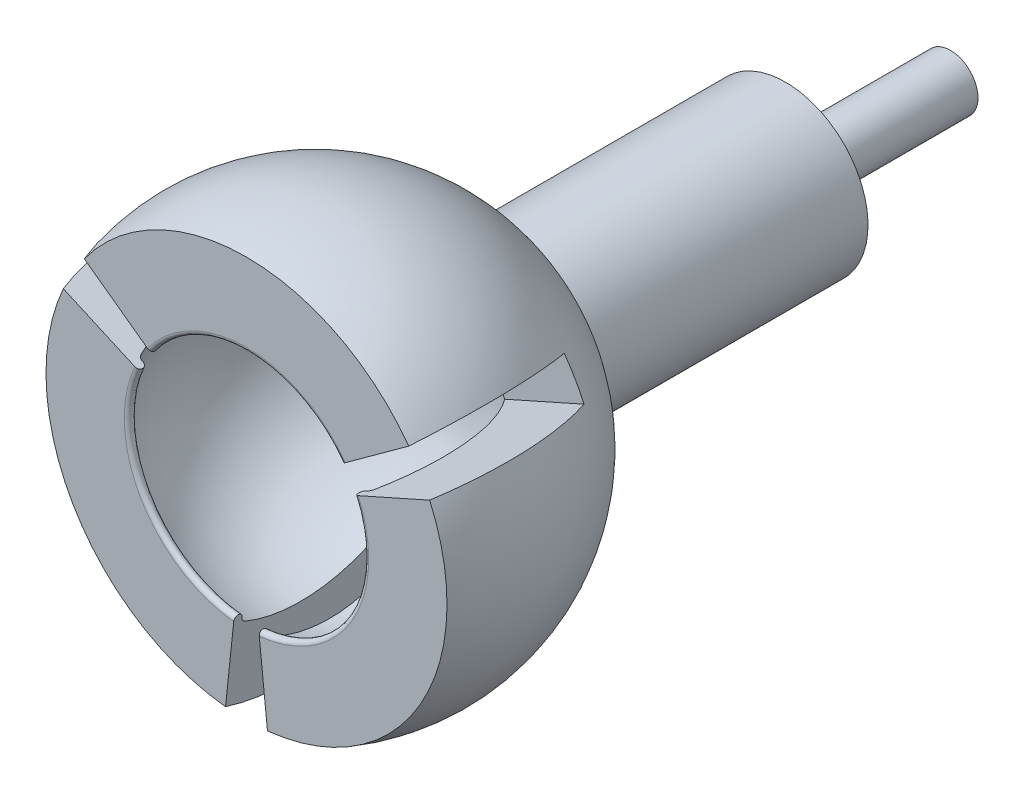
ISO-10303-21;
HEADER;
FILE_DESCRIPTION(('STEP AP214'),'2;1');
FILE_NAME('part.step','',(''),(''),'','','');
FILE_SCHEMA(('AUTOMOTIVE_DESIGN { 1 0 10303 214 1 1 1 1 }'));
ENDSEC;
DATA;
#1=APPLICATION_CONTEXT('core data for automotive mechanical design processes');
#2=APPLICATION_PROTOCOL_DEFINITION('international standard','automotive_design',2000,#1);
#3=PRODUCT_CONTEXT('',#1,'mechanical');
#4=PRODUCT('Part','Part','',(#3));
#5=PRODUCT_RELATED_PRODUCT_CATEGORY('part','',(#4));
#6=PRODUCT_DEFINITION_FORMATION('','',#4);
#7=PRODUCT_DEFINITION_CONTEXT('part definition',#1,'design');
#8=PRODUCT_DEFINITION('design','',#6,#7);
#9=PRODUCT_DEFINITION_SHAPE('','',#8);
#10=(LENGTH_UNIT() NAMED_UNIT(*) SI_UNIT(.MILLI.,.METRE.));
#11=(NAMED_UNIT(*) PLANE_ANGLE_UNIT() SI_UNIT($,.RADIAN.));
#12=(NAMED_UNIT(*) SI_UNIT($,.STERADIAN.) SOLID_ANGLE_UNIT());
#13=UNCERTAINTY_MEASURE_WITH_UNIT(LENGTH_MEASURE(1.E-05),#10,'distance_accuracy_value','');
#14=(GEOMETRIC_REPRESENTATION_CONTEXT(3) GLOBAL_UNCERTAINTY_ASSIGNED_CONTEXT((#13)) GLOBAL_UNIT_ASSIGNED_CONTEXT((#10,
#11,#12)) REPRESENTATION_CONTEXT('',''));
#15=CARTESIAN_POINT('',(0.,0.,0.));
#16=DIRECTION('',(0.,0.,1.));
#17=DIRECTION('',(1.,0.,0.));
#18=AXIS2_PLACEMENT_3D('',#15,#16,#17);
#19=CARTESIAN_POINT('',(0.,-7.29109045342327,19.6));
#20=DIRECTION('',(0.,0.,1.));
#21=DIRECTION('',(0.,-1.,0.));
#22=AXIS2_PLACEMENT_3D('',#19,#20,#21);
#23=PLANE('',#22);
#24=CARTESIAN_POINT('',(0.,0.,19.6));
#25=DIRECTION('',(0.,0.,1.));
#26=DIRECTION('',(0.,-1.,0.));
#27=AXIS2_PLACEMENT_3D('',#24,#25,#26);
#28=CIRCLE('',#27,7.29109045342327);
#29=CARTESIAN_POINT('',(5.89861608434435,4.28559544165267,19.6));
#30=VERTEX_POINT('',#29);
#31=CARTESIAN_POINT('',(-5.89861608434441,4.28559544165258,19.6));
#32=VERTEX_POINT('',#31);
#33=EDGE_CURVE('E287',#30,#32,#28,.T.);
#34=ORIENTED_EDGE('',*,*,#33,.T.);
#35=DIRECTION('',(-0.809016994374953,0.587785252292466,0.));
#36=VECTOR('',#35,1.);
#37=CARTESIAN_POINT('',(-5.89861608434441,4.28559544165258,19.6));
#38=LINE('',#37,#36);
#39=CARTESIAN_POINT('',(-3.5962602665025,2.61283602538991,19.6));
#40=VERTEX_POINT('',#39);
#41=EDGE_CURVE('E170',#40,#32,#38,.T.);
#42=ORIENTED_EDGE('',*,*,#41,.F.);
#43=CARTESIAN_POINT('',(0.,0.,19.6));
#44=DIRECTION('',(0.,0.,1.));
#45=DIRECTION('',(0.,-1.,0.));
#46=AXIS2_PLACEMENT_3D('',#43,#44,#45);
#47=CIRCLE('',#46,4.44522215417857);
#48=CARTESIAN_POINT('',(3.59626026650247,2.61283602538996,19.6));
#49=VERTEX_POINT('',#48);
#50=EDGE_CURVE('E282',#49,#40,#47,.T.);
#51=ORIENTED_EDGE('',*,*,#50,.F.);
#52=DIRECTION('',(0.809016994374945,0.587785252292477,0.));
#53=VECTOR('',#52,1.);
#54=CARTESIAN_POINT('',(5.89861608434435,4.28559544165267,19.6));
#55=LINE('',#54,#53);
#56=EDGE_CURVE('E220',#49,#30,#55,.T.);
#57=ORIENTED_EDGE('',*,*,#56,.T.);
#58=EDGE_LOOP('',(#34,#42,#51,#57));
#59=FACE_BOUND('',#58,.T.);
#60=ADVANCED_FACE('F43',(#59),#23,.T.);
#61=CARTESIAN_POINT('',(0.,0.,19.45));
#62=DIRECTION('',(0.,0.,1.));
#63=DIRECTION('',(0.,-1.,0.));
#64=AXIS2_PLACEMENT_3D('',#61,#62,#63);
#65=TOROIDAL_SURFACE('',#64,4.44522215417857,0.15);
#66=ORIENTED_EDGE('',*,*,#50,.T.);
#67=CARTESIAN_POINT('',(-3.5962602665025,2.61283602538991,19.45));
#68=DIRECTION('',(-0.587785252292466,-0.809016994374953,0.));
#69=DIRECTION('',(0.,0.,-1.));
#70=AXIS2_PLACEMENT_3D('',#67,#68,#69);
#71=CIRCLE('',#70,0.150000000000001);
#72=CARTESIAN_POINT('',(-3.60581110479052,2.61977511558426,19.3004652865878));
#73=VERTEX_POINT('',#72);
#74=EDGE_CURVE('E383',#73,#40,#71,.T.);
#75=ORIENTED_EDGE('',*,*,#74,.F.);
#76=CARTESIAN_POINT('',(0.,0.,19.3004652865878));
#77=DIRECTION('',(0.,0.,1.));
#78=DIRECTION('',(0.,-1.,0.));
#79=AXIS2_PLACEMENT_3D('',#76,#77,#78);
#80=CIRCLE('',#79,4.45702763954465);
#81=CARTESIAN_POINT('',(3.60581110479049,2.61977511558431,19.3004652865878));
#82=VERTEX_POINT('',#81);
#83=EDGE_CURVE('E277',#82,#73,#80,.T.);
#84=ORIENTED_EDGE('',*,*,#83,.F.);
#85=CARTESIAN_POINT('',(3.59626026650247,2.61283602538996,19.45));
#86=DIRECTION('',(-0.587785252292477,0.809016994374945,0.));
#87=DIRECTION('',(0.,0.,-1.));
#88=AXIS2_PLACEMENT_3D('',#85,#86,#87);
#89=CIRCLE('',#88,0.150000000000001);
#90=EDGE_CURVE('E217',#82,#49,#89,.T.);
#91=ORIENTED_EDGE('',*,*,#90,.T.);
#92=EDGE_LOOP('',(#66,#75,#84,#91));
#93=FACE_BOUND('',#92,.T.);
#94=ADVANCED_FACE('F311',(#93),#65,.T.);
#95=CARTESIAN_POINT('',(0.,0.,19.1010856687048));
#96=DIRECTION('',(0.,0.,1.));
#97=DIRECTION('',(0.,-1.,0.));
#98=AXIS2_PLACEMENT_3D('',#95,#96,#97);
#99=TOROIDAL_SURFACE('',#98,4.47276828669942,0.199999999999998);
#100=ORIENTED_EDGE('',*,*,#83,.T.);
#101=CARTESIAN_POINT('',(-3.61854555584117,2.62902723584336,19.1010856687048));
#102=DIRECTION('',(0.587785252292466,0.809016994374953,0.));
#103=DIRECTION('',(0.,0.,-1.));
#104=AXIS2_PLACEMENT_3D('',#101,#102,#103);
#105=CIRCLE('',#104,0.199999999999998);
#106=CARTESIAN_POINT('',(-3.76624129281428,2.73633446995941,19.1827626347744));
#107=VERTEX_POINT('',#106);
#108=EDGE_CURVE('E389',#107,#73,#105,.T.);
#109=ORIENTED_EDGE('',*,*,#108,.F.);
#110=CARTESIAN_POINT('',(0.,0.,19.1827626347744));
#111=DIRECTION('',(0.,0.,1.));
#112=DIRECTION('',(0.,-1.,0.));
#113=AXIS2_PLACEMENT_3D('',#110,#111,#112);
#114=CIRCLE('',#113,4.65533025758511);
#115=CARTESIAN_POINT('',(3.76624129281424,2.73633446995946,19.1827626347744));
#116=VERTEX_POINT('',#115);
#117=EDGE_CURVE('E272',#116,#107,#114,.T.);
#118=ORIENTED_EDGE('',*,*,#117,.F.);
#119=CARTESIAN_POINT('',(3.61854555584113,2.62902723584341,19.1010856687048));
#120=DIRECTION('',(0.587785252292477,-0.809016994374945,0.));
#121=DIRECTION('',(0.,0.,-1.));
#122=AXIS2_PLACEMENT_3D('',#119,#120,#121);
#123=CIRCLE('',#122,0.199999999999998);
#124=EDGE_CURVE('E214',#116,#82,#123,.T.);
#125=ORIENTED_EDGE('',*,*,#124,.T.);
#126=EDGE_LOOP('',(#100,#109,#118,#125));
#127=FACE_BOUND('',#126,.T.);
#128=ADVANCED_FACE('F320',(#127),#99,.F.);
#129=CARTESIAN_POINT('',(0.762126480641795,-7.25114909704004,19.6));
#130=VERTEX_POINT('',#129);
#131=CARTESIAN_POINT('',(6.66074256498615,2.96555365538742,19.6));
#132=VERTEX_POINT('',#131);
#133=EDGE_CURVE('E283',#130,#132,#28,.T.);
#134=ORIENTED_EDGE('',*,*,#133,.T.);
#135=DIRECTION('',(0.913545457642599,0.406736643075804,0.));
#136=VECTOR('',#135,1.);
#137=CARTESIAN_POINT('',(6.66074256498615,2.96555365538742,19.6));
#138=LINE('',#137,#136);
#139=CARTESIAN_POINT('',(4.06091250716208,1.80803473671678,19.6));
#140=VERTEX_POINT('',#139);
#141=EDGE_CURVE('E204',#140,#132,#138,.T.);
#142=ORIENTED_EDGE('',*,*,#141,.F.);
#143=CARTESIAN_POINT('',(0.464652240659615,-4.42087076210671,19.6));
#144=VERTEX_POINT('',#143);
#145=EDGE_CURVE('E278',#144,#140,#47,.T.);
#146=ORIENTED_EDGE('',*,*,#145,.F.);
#147=DIRECTION('',(0.104528463267654,-0.994521895368273,0.));
#148=VECTOR('',#147,1.);
#149=CARTESIAN_POINT('',(0.762126480641795,-7.25114909704004,19.6));
#150=LINE('',#149,#148);
#151=EDGE_CURVE('E258',#144,#130,#150,.T.);
#152=ORIENTED_EDGE('',*,*,#151,.T.);
#153=EDGE_LOOP('',(#134,#142,#146,#152));
#154=FACE_BOUND('',#153,.T.);
#155=ADVANCED_FACE('F314',(#154),#23,.T.);
#156=ORIENTED_EDGE('',*,*,#145,.T.);
#157=CARTESIAN_POINT('',(4.06091250716208,1.80803473671679,19.45));
#158=DIRECTION('',(-0.406736643075804,0.913545457642599,0.));
#159=DIRECTION('',(0.,0.,-1.));
#160=AXIS2_PLACEMENT_3D('',#157,#158,#159);
#161=CIRCLE('',#160,0.150000000000001);
#162=CARTESIAN_POINT('',(4.07169735469356,1.81283646020448,19.3004652865878));
#163=VERTEX_POINT('',#162);
#164=EDGE_CURVE('E202',#163,#140,#161,.T.);
#165=ORIENTED_EDGE('',*,*,#164,.F.);
#166=CARTESIAN_POINT('',(0.465886249903063,-4.43261157578876,19.3004652865878));
#167=VERTEX_POINT('',#166);
#168=EDGE_CURVE('E273',#167,#163,#80,.T.);
#169=ORIENTED_EDGE('',*,*,#168,.F.);
#170=CARTESIAN_POINT('',(0.464652240659615,-4.42087076210671,19.45));
#171=DIRECTION('',(0.994521895368273,0.104528463267654,0.));
#172=DIRECTION('',(0.,0.,-1.));
#173=AXIS2_PLACEMENT_3D('',#170,#171,#172);
#174=CIRCLE('',#173,0.150000000000001);
#175=EDGE_CURVE('E255',#167,#144,#174,.T.);
#176=ORIENTED_EDGE('',*,*,#175,.T.);
#177=EDGE_LOOP('',(#156,#165,#169,#176));
#178=FACE_BOUND('',#177,.T.);
#179=ADVANCED_FACE('F323',(#178),#65,.T.);
#180=ORIENTED_EDGE('',*,*,#168,.T.);
#181=CARTESIAN_POINT('',(4.08607715140213,1.81923875818804,19.1010856687048));
#182=DIRECTION('',(0.406736643075804,-0.913545457642599,0.));
#183=DIRECTION('',(0.,0.,-1.));
#184=AXIS2_PLACEMENT_3D('',#181,#182,#183);
#185=CIRCLE('',#184,0.199999999999998);
#186=CARTESIAN_POINT('',(4.25285581064303,1.89349340137938,19.1827626347744));
#187=VERTEX_POINT('',#186);
#188=EDGE_CURVE('E200',#187,#163,#185,.T.);
#189=ORIENTED_EDGE('',*,*,#188,.F.);
#190=CARTESIAN_POINT('',(0.486614517828782,-4.62982787133882,19.1827626347744));
#191=VERTEX_POINT('',#190);
#192=EDGE_CURVE('E268',#191,#187,#114,.T.);
#193=ORIENTED_EDGE('',*,*,#192,.F.);
#194=CARTESIAN_POINT('',(0.467531595560987,-4.44826599403141,19.1010856687048));
#195=DIRECTION('',(-0.994521895368273,-0.104528463267654,0.));
#196=DIRECTION('',(0.,0.,-1.));
#197=AXIS2_PLACEMENT_3D('',#194,#195,#196);
#198=CIRCLE('',#197,0.199999999999998);
#199=EDGE_CURVE('E252',#191,#167,#198,.T.);
#200=ORIENTED_EDGE('',*,*,#199,.T.);
#201=EDGE_LOOP('',(#180,#189,#193,#200));
#202=FACE_BOUND('',#201,.T.);
#203=ADVANCED_FACE('F308',(#202),#99,.F.);
#204=CARTESIAN_POINT('',(0.,-1.,-6.));
#205=DIRECTION('',(0.,0.,-1.));
#206=DIRECTION('',(0.,1.,0.));
#207=AXIS2_PLACEMENT_3D('',#204,#205,#206);
#208=PLANE('',#207);
#209=CARTESIAN_POINT('',(0.,0.,-6.));
#210=DIRECTION('',(0.,0.,1.));
#211=DIRECTION('',(1.,0.,0.));
#212=AXIS2_PLACEMENT_3D('',#209,#210,#211);
#213=CIRCLE('',#212,0.75);
#214=CARTESIAN_POINT('',(0.75,0.,-6.));
#215=VERTEX_POINT('',#214);
#216=EDGE_CURVE('E407',#215,#215,#213,.T.);
#217=ORIENTED_EDGE('',*,*,#216,.T.);
#218=EDGE_LOOP('',(#217));
#219=FACE_BOUND('',#218,.T.);
#220=CARTESIAN_POINT('',(0.,0.,-6.));
#221=DIRECTION('',(0.,0.,1.));
#222=DIRECTION('',(0.,-1.,0.));
#223=AXIS2_PLACEMENT_3D('',#220,#221,#222);
#224=CIRCLE('',#223,1.);
#225=CARTESIAN_POINT('',(0.,-1.,-6.));
#226=VERTEX_POINT('',#225);
#227=EDGE_CURVE('E11',#226,#226,#224,.T.);
#228=ORIENTED_EDGE('',*,*,#227,.F.);
#229=EDGE_LOOP('',(#228));
#230=FACE_BOUND('',#229,.T.);
#231=ADVANCED_FACE('F45',(#219,#230),#208,.T.);
#232=CARTESIAN_POINT('',(0.,0.,0.));
#233=DIRECTION('',(0.,0.,1.));
#234=DIRECTION('',(0.,-1.,0.));
#235=AXIS2_PLACEMENT_3D('',#232,#233,#234);
#236=CYLINDRICAL_SURFACE('',#235,0.999999999999999);
#237=ORIENTED_EDGE('',*,*,#227,.T.);
#238=EDGE_LOOP('',(#237));
#239=FACE_BOUND('',#238,.T.);
#240=CARTESIAN_POINT('',(0.,0.,0.));
#241=DIRECTION('',(0.,0.,1.));
#242=DIRECTION('',(0.,-1.,0.));
#243=AXIS2_PLACEMENT_3D('',#240,#241,#242);
#244=CIRCLE('',#243,0.999999999999999);
#245=CARTESIAN_POINT('',(0.,-0.999999999999999,0.));
#246=VERTEX_POINT('',#245);
#247=EDGE_CURVE('E52',#246,#246,#244,.T.);
#248=ORIENTED_EDGE('',*,*,#247,.F.);
#249=EDGE_LOOP('',(#248));
#250=FACE_BOUND('',#249,.T.);
#251=ADVANCED_FACE('F299',(#239,#250),#236,.T.);
#252=CARTESIAN_POINT('',(0.,-3.,0.));
#253=DIRECTION('',(0.,0.,-1.));
#254=DIRECTION('',(0.,1.,0.));
#255=AXIS2_PLACEMENT_3D('',#252,#253,#254);
#256=PLANE('',#255);
#257=ORIENTED_EDGE('',*,*,#247,.T.);
#258=EDGE_LOOP('',(#257));
#259=FACE_BOUND('',#258,.T.);
#260=CARTESIAN_POINT('',(0.,0.,0.));
#261=DIRECTION('',(0.,0.,1.));
#262=DIRECTION('',(0.,-1.,0.));
#263=AXIS2_PLACEMENT_3D('',#260,#261,#262);
#264=CIRCLE('',#263,3.);
#265=CARTESIAN_POINT('',(0.,-3.,0.));
#266=VERTEX_POINT('',#265);
#267=EDGE_CURVE('E290',#266,#266,#264,.T.);
#268=ORIENTED_EDGE('',*,*,#267,.F.);
#269=EDGE_LOOP('',(#268));
#270=FACE_BOUND('',#269,.T.);
#271=ADVANCED_FACE('F296',(#259,#270),#256,.T.);
#272=CARTESIAN_POINT('',(0.,0.,0.));
#273=DIRECTION('',(0.,0.,1.));
#274=DIRECTION('',(0.,-1.,0.));
#275=AXIS2_PLACEMENT_3D('',#272,#273,#274);
#276=CYLINDRICAL_SURFACE('',#275,3.);
#277=ORIENTED_EDGE('',*,*,#267,.T.);
#278=EDGE_LOOP('',(#277));
#279=FACE_BOUND('',#278,.T.);
#280=CARTESIAN_POINT('',(0.,0.,10.));
#281=DIRECTION('',(0.,0.,1.));
#282=DIRECTION('',(0.,-1.,0.));
#283=AXIS2_PLACEMENT_3D('',#280,#281,#282);
#284=CIRCLE('',#283,3.);
#285=CARTESIAN_POINT('',(0.,-3.,10.));
#286=VERTEX_POINT('',#285);
#287=EDGE_CURVE('E286',#286,#286,#284,.T.);
#288=ORIENTED_EDGE('',*,*,#287,.F.);
#289=EDGE_LOOP('',(#288));
#290=FACE_BOUND('',#289,.T.);
#291=ADVANCED_FACE('F305',(#279,#290),#276,.T.);
#292=CARTESIAN_POINT('',(0.,0.,17.1));
#293=DIRECTION('',(0.,0.,1.));
#294=DIRECTION('',(0.,-1.,0.));
#295=AXIS2_PLACEMENT_3D('',#292,#293,#294);
#296=SPHERICAL_SURFACE('',#295,7.70778826901725);
#297=CARTESIAN_POINT('',(0.,0.,17.1));
#298=DIRECTION('',(-0.406736643075791,-0.913545457642605,0.));
#299=DIRECTION('',(0.,0.,-1.));
#300=AXIS2_PLACEMENT_3D('',#297,#298,#299);
#301=CIRCLE('',#300,7.70778826901725);
#302=CARTESIAN_POINT('',(-6.66074256498619,2.96555365538733,19.6));
#303=VERTEX_POINT('',#302);
#304=CARTESIAN_POINT('',(-6.27360340617274,2.79318819667737,13.6));
#305=VERTEX_POINT('',#304);
#306=EDGE_CURVE('E189',#303,#305,#301,.T.);
#307=ORIENTED_EDGE('',*,*,#306,.T.);
#308=CARTESIAN_POINT('',(0.,0.,13.6));
#309=DIRECTION('',(0.,0.,-1.));
#310=DIRECTION('',(0.499999999999992,0.866025403784443,0.));
#311=AXIS2_PLACEMENT_3D('',#308,#309,#310);
#312=CIRCLE('',#311,6.86731388535576);
#313=CARTESIAN_POINT('',(-5.55577363895989,4.03650582467538,13.6));
#314=VERTEX_POINT('',#313);
#315=EDGE_CURVE('E178',#305,#314,#312,.T.);
#316=ORIENTED_EDGE('',*,*,#315,.T.);
#317=CARTESIAN_POINT('',(0.,0.,17.1));
#318=DIRECTION('',(-0.587785252292466,-0.809016994374953,0.));
#319=DIRECTION('',(0.,0.,-1.));
#320=AXIS2_PLACEMENT_3D('',#317,#318,#319);
#321=CIRCLE('',#320,7.70778826901725);
#322=EDGE_CURVE('E167',#32,#314,#321,.T.);
#323=ORIENTED_EDGE('',*,*,#322,.F.);
#324=ORIENTED_EDGE('',*,*,#33,.F.);
#325=CARTESIAN_POINT('',(0.,0.,17.1));
#326=DIRECTION('',(-0.587785252292477,0.809016994374945,0.));
#327=DIRECTION('',(0.,0.,-1.));
#328=AXIS2_PLACEMENT_3D('',#325,#326,#327);
#329=CIRCLE('',#328,7.70778826901725);
#330=CARTESIAN_POINT('',(5.55577363895983,4.03650582467546,13.6));
#331=VERTEX_POINT('',#330);
#332=EDGE_CURVE('E206',#30,#331,#329,.T.);
#333=ORIENTED_EDGE('',*,*,#332,.T.);
#334=CARTESIAN_POINT('',(0.,0.,13.6));
#335=DIRECTION('',(0.,0.,-1.));
#336=DIRECTION('',(0.500000000000004,-0.866025403784436,0.));
#337=AXIS2_PLACEMENT_3D('',#334,#335,#336);
#338=CIRCLE('',#337,6.86731388535576);
#339=CARTESIAN_POINT('',(6.2736034061727,2.79318819667746,13.6));
#340=VERTEX_POINT('',#339);
#341=EDGE_CURVE('E225',#331,#340,#338,.T.);
#342=ORIENTED_EDGE('',*,*,#341,.T.);
#343=CARTESIAN_POINT('',(0.,0.,17.1));
#344=DIRECTION('',(-0.406736643075804,0.913545457642599,0.));
#345=DIRECTION('',(0.,0.,-1.));
#346=AXIS2_PLACEMENT_3D('',#343,#344,#345);
#347=CIRCLE('',#346,7.70778826901725);
#348=EDGE_CURVE('E190',#132,#340,#347,.T.);
#349=ORIENTED_EDGE('',*,*,#348,.F.);
#350=ORIENTED_EDGE('',*,*,#133,.F.);
#351=CARTESIAN_POINT('',(0.,0.,17.1));
#352=DIRECTION('',(0.994521895368273,0.104528463267654,0.));
#353=DIRECTION('',(0.,0.,-1.));
#354=AXIS2_PLACEMENT_3D('',#351,#352,#353);
#355=CIRCLE('',#354,7.70778826901725);
#356=CARTESIAN_POINT('',(0.717829767212857,-6.82969402135287,13.6));
#357=VERTEX_POINT('',#356);
#358=EDGE_CURVE('E244',#130,#357,#355,.T.);
#359=ORIENTED_EDGE('',*,*,#358,.T.);
#360=CARTESIAN_POINT('',(0.,0.,13.6));
#361=DIRECTION('',(0.,0.,-1.));
#362=DIRECTION('',(-1.,0.,0.));
#363=AXIS2_PLACEMENT_3D('',#360,#361,#362);
#364=CIRCLE('',#363,6.86731388535576);
#365=CARTESIAN_POINT('',(-0.717829767212857,-6.82969402135287,13.6));
#366=VERTEX_POINT('',#365);
#367=EDGE_CURVE('E264',#357,#366,#364,.T.);
#368=ORIENTED_EDGE('',*,*,#367,.T.);
#369=CARTESIAN_POINT('',(0.,0.,17.1));
#370=DIRECTION('',(0.994521895368273,-0.104528463267654,0.));
#371=DIRECTION('',(0.,0.,-1.));
#372=AXIS2_PLACEMENT_3D('',#369,#370,#371);
#373=CIRCLE('',#372,7.70778826901725);
#374=CARTESIAN_POINT('',(-0.762126480641795,-7.25114909704004,19.6));
#375=VERTEX_POINT('',#374);
#376=EDGE_CURVE('E228',#375,#366,#373,.T.);
#377=ORIENTED_EDGE('',*,*,#376,.F.);
#378=EDGE_CURVE('E281',#303,#375,#28,.T.);
#379=ORIENTED_EDGE('',*,*,#378,.F.);
#380=EDGE_LOOP('',(#307,#316,#323,#324,#333,#342,#349,#350,#359,#368,#377,#379));
#381=FACE_BOUND('',#380,.T.);
#382=ORIENTED_EDGE('',*,*,#287,.T.);
#383=EDGE_LOOP('',(#382));
#384=FACE_BOUND('',#383,.T.);
#385=ADVANCED_FACE('F186',(#381,#384),#296,.T.);
#386=DIRECTION('',(-0.913545457642605,0.406736643075791,0.));
#387=VECTOR('',#386,1.);
#388=CARTESIAN_POINT('',(-6.66074256498619,2.96555365538733,19.6));
#389=LINE('',#388,#387);
#390=CARTESIAN_POINT('',(-4.06091250716211,1.80803473671673,19.6));
#391=VERTEX_POINT('',#390);
#392=EDGE_CURVE('E193',#391,#303,#389,.T.);
#393=ORIENTED_EDGE('',*,*,#392,.T.);
#394=ORIENTED_EDGE('',*,*,#378,.T.);
#395=DIRECTION('',(-0.104528463267654,-0.994521895368273,0.));
#396=VECTOR('',#395,1.);
#397=CARTESIAN_POINT('',(-0.762126480641795,-7.25114909704004,19.6));
#398=LINE('',#397,#396);
#399=CARTESIAN_POINT('',(-0.464652240659615,-4.42087076210671,19.6));
#400=VERTEX_POINT('',#399);
#401=EDGE_CURVE('E241',#400,#375,#398,.T.);
#402=ORIENTED_EDGE('',*,*,#401,.F.);
#403=EDGE_CURVE('E276',#391,#400,#47,.T.);
#404=ORIENTED_EDGE('',*,*,#403,.F.);
#405=EDGE_LOOP('',(#393,#394,#402,#404));
#406=FACE_BOUND('',#405,.T.);
#407=ADVANCED_FACE('F315',(#406),#23,.T.);
#408=CARTESIAN_POINT('',(-4.06091250716211,1.80803473671673,19.45));
#409=DIRECTION('',(-0.406736643075791,-0.913545457642605,0.));
#410=DIRECTION('',(0.,0.,-1.));
#411=AXIS2_PLACEMENT_3D('',#408,#409,#410);
#412=CIRCLE('',#411,0.150000000000001);
#413=CARTESIAN_POINT('',(-4.07169735469358,1.81283646020442,19.3004652865878));
#414=VERTEX_POINT('',#413);
#415=EDGE_CURVE('E341',#414,#391,#412,.T.);
#416=ORIENTED_EDGE('',*,*,#415,.T.);
#417=ORIENTED_EDGE('',*,*,#403,.T.);
#418=CARTESIAN_POINT('',(-0.464652240659615,-4.42087076210671,19.45));
#419=DIRECTION('',(0.994521895368273,-0.104528463267654,0.));
#420=DIRECTION('',(0.,0.,-1.));
#421=AXIS2_PLACEMENT_3D('',#418,#419,#420);
#422=CIRCLE('',#421,0.150000000000001);
#423=CARTESIAN_POINT('',(-0.465886249903063,-4.43261157578876,19.3004652865878));
#424=VERTEX_POINT('',#423);
#425=EDGE_CURVE('E238',#424,#400,#422,.T.);
#426=ORIENTED_EDGE('',*,*,#425,.F.);
#427=EDGE_CURVE('E271',#414,#424,#80,.T.);
#428=ORIENTED_EDGE('',*,*,#427,.F.);
#429=EDGE_LOOP('',(#416,#417,#426,#428));
#430=FACE_BOUND('',#429,.T.);
#431=ADVANCED_FACE('F324',(#430),#65,.T.);
#432=CARTESIAN_POINT('',(-4.08607715140215,1.81923875818798,19.1010856687048));
#433=DIRECTION('',(0.406736643075791,0.913545457642605,0.));
#434=DIRECTION('',(0.,0.,-1.));
#435=AXIS2_PLACEMENT_3D('',#432,#433,#434);
#436=CIRCLE('',#435,0.199999999999998);
#437=CARTESIAN_POINT('',(-4.25285581064305,1.89349340137932,19.1827626347744));
#438=VERTEX_POINT('',#437);
#439=EDGE_CURVE('E395',#438,#414,#436,.T.);
#440=ORIENTED_EDGE('',*,*,#439,.T.);
#441=ORIENTED_EDGE('',*,*,#427,.T.);
#442=CARTESIAN_POINT('',(-0.467531595560987,-4.44826599403141,19.1010856687048));
#443=DIRECTION('',(-0.994521895368273,0.104528463267654,0.));
#444=DIRECTION('',(0.,0.,-1.));
#445=AXIS2_PLACEMENT_3D('',#442,#443,#444);
#446=CIRCLE('',#445,0.199999999999998);
#447=CARTESIAN_POINT('',(-0.486614517828782,-4.62982787133882,19.1827626347744));
#448=VERTEX_POINT('',#447);
#449=EDGE_CURVE('E235',#448,#424,#446,.T.);
#450=ORIENTED_EDGE('',*,*,#449,.F.);
#451=EDGE_CURVE('E267',#438,#448,#114,.T.);
#452=ORIENTED_EDGE('',*,*,#451,.F.);
#453=EDGE_LOOP('',(#440,#441,#450,#452));
#454=FACE_BOUND('',#453,.T.);
#455=ADVANCED_FACE('F334',(#454),#99,.F.);
#456=CARTESIAN_POINT('',(0.,0.,17.1));
#457=DIRECTION('',(0.,0.,1.));
#458=DIRECTION('',(0.,-1.,0.));
#459=AXIS2_PLACEMENT_3D('',#456,#457,#458);
#460=SPHERICAL_SURFACE('',#459,5.1);
#461=CARTESIAN_POINT('',(0.,0.,12.0554484837599));
#462=DIRECTION('',(0.,0.,1.));
#463=DIRECTION('',(1.,0.,0.));
#464=AXIS2_PLACEMENT_3D('',#461,#462,#463);
#465=CIRCLE('',#464,0.75);
#466=CARTESIAN_POINT('',(0.75,0.,12.0554484837599));
#467=VERTEX_POINT('',#466);
#468=EDGE_CURVE('E47',#467,#467,#465,.T.);
#469=ORIENTED_EDGE('',*,*,#468,.F.);
#470=EDGE_LOOP('',(#469));
#471=FACE_BOUND('',#470,.T.);
#472=CARTESIAN_POINT('',(0.,0.,17.1));
#473=DIRECTION('',(0.406736643075791,0.913545457642605,0.));
#474=DIRECTION('',(0.,0.,-1.));
#475=AXIS2_PLACEMENT_3D('',#472,#473,#474);
#476=CIRCLE('',#475,5.1);
#477=CARTESIAN_POINT('',(-3.38874882098821,1.50876818240939,13.6));
#478=VERTEX_POINT('',#477);
#479=EDGE_CURVE('E392',#478,#438,#476,.T.);
#480=ORIENTED_EDGE('',*,*,#479,.T.);
#481=ORIENTED_EDGE('',*,*,#451,.T.);
#482=CARTESIAN_POINT('',(0.,0.,17.1));
#483=DIRECTION('',(-0.994521895368273,0.104528463267654,0.));
#484=DIRECTION('',(0.,0.,-1.));
#485=AXIS2_PLACEMENT_3D('',#482,#483,#484);
#486=CIRCLE('',#485,5.1);
#487=CARTESIAN_POINT('',(-0.387742836105862,-3.68912665722506,13.6));
#488=VERTEX_POINT('',#487);
#489=EDGE_CURVE('E232',#488,#448,#486,.T.);
#490=ORIENTED_EDGE('',*,*,#489,.F.);
#491=CARTESIAN_POINT('',(0.,0.,13.6));
#492=DIRECTION('',(0.,0.,-1.));
#493=DIRECTION('',(-1.,0.,0.));
#494=AXIS2_PLACEMENT_3D('',#491,#492,#493);
#495=CIRCLE('',#494,3.70944739819827);
#496=CARTESIAN_POINT('',(0.387742836105862,-3.68912665722506,13.6));
#497=VERTEX_POINT('',#496);
#498=EDGE_CURVE('E261',#497,#488,#495,.T.);
#499=ORIENTED_EDGE('',*,*,#498,.F.);
#500=CARTESIAN_POINT('',(0.,0.,17.1));
#501=DIRECTION('',(-0.994521895368273,-0.104528463267654,0.));
#502=DIRECTION('',(0.,0.,-1.));
#503=AXIS2_PLACEMENT_3D('',#500,#501,#502);
#504=CIRCLE('',#503,5.1);
#505=EDGE_CURVE('E249',#497,#191,#504,.T.);
#506=ORIENTED_EDGE('',*,*,#505,.T.);
#507=ORIENTED_EDGE('',*,*,#192,.T.);
#508=CARTESIAN_POINT('',(0.,0.,17.1));
#509=DIRECTION('',(0.406736643075804,-0.913545457642599,0.));
#510=DIRECTION('',(0.,0.,-1.));
#511=AXIS2_PLACEMENT_3D('',#508,#509,#510);
#512=CIRCLE('',#511,5.1);
#513=CARTESIAN_POINT('',(3.38874882098819,1.50876818240944,13.6));
#514=VERTEX_POINT('',#513);
#515=EDGE_CURVE('E198',#514,#187,#512,.T.);
#516=ORIENTED_EDGE('',*,*,#515,.F.);
#517=CARTESIAN_POINT('',(0.,0.,13.6));
#518=DIRECTION('',(0.,0.,-1.));
#519=DIRECTION('',(0.500000000000004,-0.866025403784436,0.));
#520=AXIS2_PLACEMENT_3D('',#517,#518,#519);
#521=CIRCLE('',#520,3.70944739819827);
#522=CARTESIAN_POINT('',(3.00100598488232,2.18035847481564,13.6));
#523=VERTEX_POINT('',#522);
#524=EDGE_CURVE('E223',#523,#514,#521,.T.);
#525=ORIENTED_EDGE('',*,*,#524,.F.);
#526=CARTESIAN_POINT('',(0.,0.,17.1));
#527=DIRECTION('',(0.587785252292477,-0.809016994374945,0.));
#528=DIRECTION('',(0.,0.,-1.));
#529=AXIS2_PLACEMENT_3D('',#526,#527,#528);
#530=CIRCLE('',#529,5.1);
#531=EDGE_CURVE('E211',#523,#116,#530,.T.);
#532=ORIENTED_EDGE('',*,*,#531,.T.);
#533=ORIENTED_EDGE('',*,*,#117,.T.);
#534=CARTESIAN_POINT('',(0.,0.,17.1));
#535=DIRECTION('',(0.587785252292466,0.809016994374953,0.));
#536=DIRECTION('',(0.,0.,-1.));
#537=AXIS2_PLACEMENT_3D('',#534,#535,#536);
#538=CIRCLE('',#537,5.1);
#539=CARTESIAN_POINT('',(-3.00100598488235,2.1803584748156,13.6));
#540=VERTEX_POINT('',#539);
#541=EDGE_CURVE('E183',#540,#107,#538,.T.);
#542=ORIENTED_EDGE('',*,*,#541,.F.);
#543=CARTESIAN_POINT('',(0.,0.,13.6));
#544=DIRECTION('',(0.,0.,-1.));
#545=DIRECTION('',(0.499999999999992,0.866025403784443,0.));
#546=AXIS2_PLACEMENT_3D('',#543,#544,#545);
#547=CIRCLE('',#546,3.70944739819827);
#548=EDGE_CURVE('E181',#478,#540,#547,.T.);
#549=ORIENTED_EDGE('',*,*,#548,.F.);
#550=EDGE_LOOP('',(#480,#481,#490,#499,#506,#507,#516,#525,#532,#533,#542,#549));
#551=FACE_BOUND('',#550,.T.);
#552=ADVANCED_FACE('F356',(#471,#551),#460,.F.);
#553=CARTESIAN_POINT('',(0.717829767212857,-6.82969402135287,13.6));
#554=DIRECTION('',(0.,0.,1.));
#555=DIRECTION('',(1.,0.,0.));
#556=AXIS2_PLACEMENT_3D('',#553,#554,#555);
#557=PLANE('',#556);
#558=ORIENTED_EDGE('',*,*,#498,.T.);
#559=DIRECTION('',(0.104528463267654,0.994521895368273,0.));
#560=VECTOR('',#559,1.);
#561=CARTESIAN_POINT('',(-0.717829767212857,-6.82969402135287,13.6));
#562=LINE('',#561,#560);
#563=EDGE_CURVE('E230',#366,#488,#562,.T.);
#564=ORIENTED_EDGE('',*,*,#563,.F.);
#565=ORIENTED_EDGE('',*,*,#367,.F.);
#566=DIRECTION('',(-0.104528463267654,0.994521895368273,0.));
#567=VECTOR('',#566,1.);
#568=CARTESIAN_POINT('',(0.717829767212857,-6.82969402135287,13.6));
#569=LINE('',#568,#567);
#570=EDGE_CURVE('E247',#357,#497,#569,.T.);
#571=ORIENTED_EDGE('',*,*,#570,.T.);
#572=EDGE_LOOP('',(#558,#564,#565,#571));
#573=FACE_BOUND('',#572,.T.);
#574=ADVANCED_FACE('F373',(#573),#557,.T.);
#575=CARTESIAN_POINT('',(0.,0.,17.1));
#576=DIRECTION('',(0.994521895368273,0.104528463267654,0.));
#577=DIRECTION('',(0.,0.,-1.));
#578=AXIS2_PLACEMENT_3D('',#575,#576,#577);
#579=PLANE('',#578);
#580=ORIENTED_EDGE('',*,*,#358,.F.);
#581=ORIENTED_EDGE('',*,*,#151,.F.);
#582=ORIENTED_EDGE('',*,*,#175,.F.);
#583=ORIENTED_EDGE('',*,*,#199,.F.);
#584=ORIENTED_EDGE('',*,*,#505,.F.);
#585=ORIENTED_EDGE('',*,*,#570,.F.);
#586=EDGE_LOOP('',(#580,#581,#582,#583,#584,#585));
#587=FACE_BOUND('',#586,.T.);
#588=ADVANCED_FACE('F369',(#587),#579,.F.);
#589=CARTESIAN_POINT('',(0.,0.,17.1));
#590=DIRECTION('',(0.994521895368273,-0.104528463267654,0.));
#591=DIRECTION('',(0.,0.,-1.));
#592=AXIS2_PLACEMENT_3D('',#589,#590,#591);
#593=PLANE('',#592);
#594=ORIENTED_EDGE('',*,*,#376,.T.);
#595=ORIENTED_EDGE('',*,*,#563,.T.);
#596=ORIENTED_EDGE('',*,*,#489,.T.);
#597=ORIENTED_EDGE('',*,*,#449,.T.);
#598=ORIENTED_EDGE('',*,*,#425,.T.);
#599=ORIENTED_EDGE('',*,*,#401,.T.);
#600=EDGE_LOOP('',(#594,#595,#596,#597,#598,#599));
#601=FACE_BOUND('',#600,.T.);
#602=ADVANCED_FACE('F377',(#601),#593,.T.);
#603=CARTESIAN_POINT('',(5.55577363895983,4.03650582467546,13.6));
#604=DIRECTION('',(0.,0.,1.));
#605=DIRECTION('',(-0.500000000000004,0.866025403784436,0.));
#606=AXIS2_PLACEMENT_3D('',#603,#604,#605);
#607=PLANE('',#606);
#608=ORIENTED_EDGE('',*,*,#524,.T.);
#609=DIRECTION('',(-0.913545457642599,-0.406736643075804,0.));
#610=VECTOR('',#609,1.);
#611=CARTESIAN_POINT('',(6.2736034061727,2.79318819667746,13.6));
#612=LINE('',#611,#610);
#613=EDGE_CURVE('E67',#340,#514,#612,.T.);
#614=ORIENTED_EDGE('',*,*,#613,.F.);
#615=ORIENTED_EDGE('',*,*,#341,.F.);
#616=DIRECTION('',(-0.809016994374945,-0.587785252292477,0.));
#617=VECTOR('',#616,1.);
#618=CARTESIAN_POINT('',(5.55577363895983,4.03650582467546,13.6));
#619=LINE('',#618,#617);
#620=EDGE_CURVE('E209',#331,#523,#619,.T.);
#621=ORIENTED_EDGE('',*,*,#620,.T.);
#622=EDGE_LOOP('',(#608,#614,#615,#621));
#623=FACE_BOUND('',#622,.T.);
#624=ADVANCED_FACE('F352',(#623),#607,.T.);
#625=CARTESIAN_POINT('',(0.,0.,17.1));
#626=DIRECTION('',(-0.587785252292477,0.809016994374945,0.));
#627=DIRECTION('',(0.,0.,-1.));
#628=AXIS2_PLACEMENT_3D('',#625,#626,#627);
#629=PLANE('',#628);
#630=ORIENTED_EDGE('',*,*,#332,.F.);
#631=ORIENTED_EDGE('',*,*,#56,.F.);
#632=ORIENTED_EDGE('',*,*,#90,.F.);
#633=ORIENTED_EDGE('',*,*,#124,.F.);
#634=ORIENTED_EDGE('',*,*,#531,.F.);
#635=ORIENTED_EDGE('',*,*,#620,.F.);
#636=EDGE_LOOP('',(#630,#631,#632,#633,#634,#635));
#637=FACE_BOUND('',#636,.T.);
#638=ADVANCED_FACE('F348',(#637),#629,.F.);
#639=CARTESIAN_POINT('',(0.,0.,17.1));
#640=DIRECTION('',(-0.406736643075804,0.913545457642599,0.));
#641=DIRECTION('',(0.,0.,-1.));
#642=AXIS2_PLACEMENT_3D('',#639,#640,#641);
#643=PLANE('',#642);
#644=ORIENTED_EDGE('',*,*,#348,.T.);
#645=ORIENTED_EDGE('',*,*,#613,.T.);
#646=ORIENTED_EDGE('',*,*,#515,.T.);
#647=ORIENTED_EDGE('',*,*,#188,.T.);
#648=ORIENTED_EDGE('',*,*,#164,.T.);
#649=ORIENTED_EDGE('',*,*,#141,.T.);
#650=EDGE_LOOP('',(#644,#645,#646,#647,#648,#649));
#651=FACE_BOUND('',#650,.T.);
#652=ADVANCED_FACE('F359',(#651),#643,.T.);
#653=CARTESIAN_POINT('',(-6.27360340617274,2.79318819667737,13.6));
#654=DIRECTION('',(0.,0.,1.));
#655=DIRECTION('',(-0.499999999999992,-0.866025403784443,0.));
#656=AXIS2_PLACEMENT_3D('',#653,#654,#655);
#657=PLANE('',#656);
#658=ORIENTED_EDGE('',*,*,#548,.T.);
#659=DIRECTION('',(0.809016994374953,-0.587785252292466,0.));
#660=VECTOR('',#659,1.);
#661=CARTESIAN_POINT('',(-5.55577363895989,4.03650582467538,13.6));
#662=LINE('',#661,#660);
#663=EDGE_CURVE('E59',#314,#540,#662,.T.);
#664=ORIENTED_EDGE('',*,*,#663,.F.);
#665=ORIENTED_EDGE('',*,*,#315,.F.);
#666=DIRECTION('',(0.913545457642605,-0.406736643075791,0.));
#667=VECTOR('',#666,1.);
#668=CARTESIAN_POINT('',(-6.27360340617274,2.79318819667737,13.6));
#669=LINE('',#668,#667);
#670=EDGE_CURVE('E398',#305,#478,#669,.T.);
#671=ORIENTED_EDGE('',*,*,#670,.T.);
#672=EDGE_LOOP('',(#658,#664,#665,#671));
#673=FACE_BOUND('',#672,.T.);
#674=ADVANCED_FACE('F177',(#673),#657,.T.);
#675=CARTESIAN_POINT('',(0.,0.,17.1));
#676=DIRECTION('',(-0.406736643075791,-0.913545457642605,0.));
#677=DIRECTION('',(0.,0.,-1.));
#678=AXIS2_PLACEMENT_3D('',#675,#676,#677);
#679=PLANE('',#678);
#680=ORIENTED_EDGE('',*,*,#306,.F.);
#681=ORIENTED_EDGE('',*,*,#392,.F.);
#682=ORIENTED_EDGE('',*,*,#415,.F.);
#683=ORIENTED_EDGE('',*,*,#439,.F.);
#684=ORIENTED_EDGE('',*,*,#479,.F.);
#685=ORIENTED_EDGE('',*,*,#670,.F.);
#686=EDGE_LOOP('',(#680,#681,#682,#683,#684,#685));
#687=FACE_BOUND('',#686,.T.);
#688=ADVANCED_FACE('F437',(#687),#679,.F.);
#689=CARTESIAN_POINT('',(0.,0.,17.1));
#690=DIRECTION('',(-0.587785252292466,-0.809016994374953,0.));
#691=DIRECTION('',(0.,0.,-1.));
#692=AXIS2_PLACEMENT_3D('',#689,#690,#691);
#693=PLANE('',#692);
#694=ORIENTED_EDGE('',*,*,#322,.T.);
#695=ORIENTED_EDGE('',*,*,#663,.T.);
#696=ORIENTED_EDGE('',*,*,#541,.T.);
#697=ORIENTED_EDGE('',*,*,#108,.T.);
#698=ORIENTED_EDGE('',*,*,#74,.T.);
#699=ORIENTED_EDGE('',*,*,#41,.T.);
#700=EDGE_LOOP('',(#694,#695,#696,#697,#698,#699));
#701=FACE_BOUND('',#700,.T.);
#702=ADVANCED_FACE('F168',(#701),#693,.T.);
#703=CARTESIAN_POINT('',(0.,0.,-6.));
#704=DIRECTION('',(0.,0.,1.));
#705=DIRECTION('',(1.,0.,0.));
#706=AXIS2_PLACEMENT_3D('',#703,#704,#705);
#707=CYLINDRICAL_SURFACE('',#706,0.75);
#708=ORIENTED_EDGE('',*,*,#468,.T.);
#709=EDGE_LOOP('',(#708));
#710=FACE_BOUND('',#709,.T.);
#711=ORIENTED_EDGE('',*,*,#216,.F.);
#712=EDGE_LOOP('',(#711));
#713=FACE_BOUND('',#712,.T.);
#714=ADVANCED_FACE('F413',(#710,#713),#707,.F.);
#715=CLOSED_SHELL('',(#60,#94,#128,#155,#179,#203,#231,#251,#271,#291,#385,#407,#431,#455,#552,
#574,#588,#602,#624,#638,#652,#674,#688,#702,#714));
#716=MANIFOLD_SOLID_BREP('B2',#715);
#717=ADVANCED_BREP_SHAPE_REPRESENTATION('',(#18,#716),#14);
#718=SHAPE_DEFINITION_REPRESENTATION(#9,#717);
ENDSEC;
END-ISO-10303-21;
